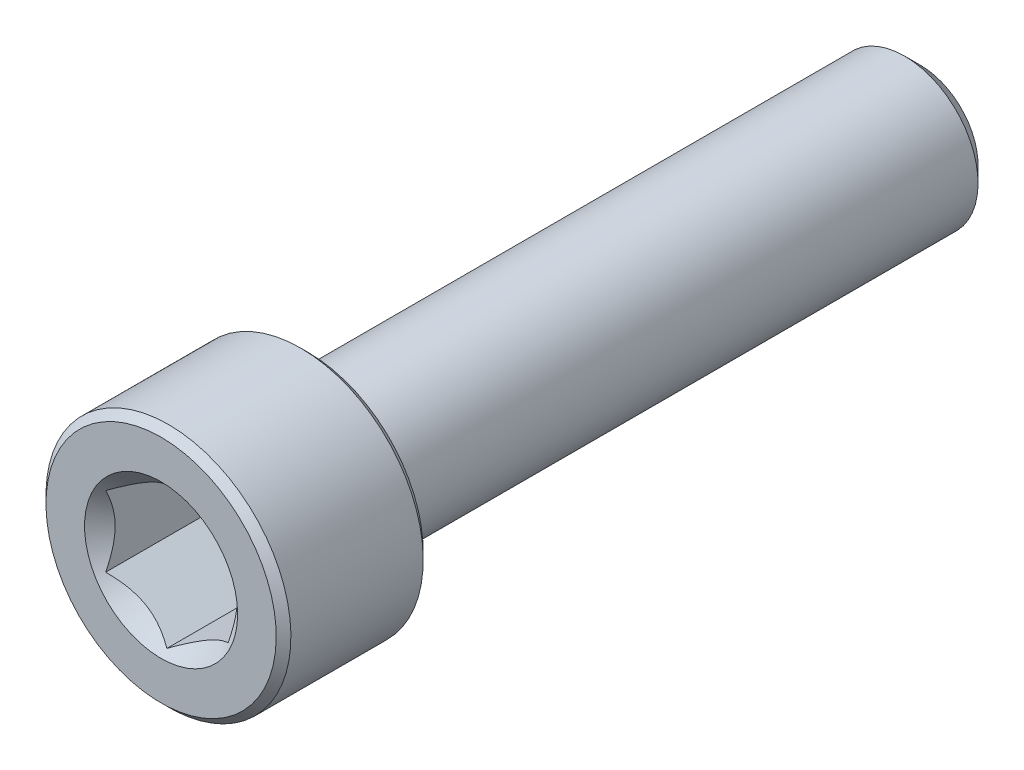
ISO-10303-21;
HEADER;
FILE_DESCRIPTION(('STEP AP214'),'2;1');
FILE_NAME('part.step','',(''),(''),'','','');
FILE_SCHEMA(('AUTOMOTIVE_DESIGN { 1 0 10303 214 1 1 1 1 }'));
ENDSEC;
DATA;
#1=APPLICATION_CONTEXT('core data for automotive mechanical design processes');
#2=APPLICATION_PROTOCOL_DEFINITION('international standard','automotive_design',2000,#1);
#3=PRODUCT_CONTEXT('',#1,'mechanical');
#4=PRODUCT('Part','Part','',(#3));
#5=PRODUCT_RELATED_PRODUCT_CATEGORY('part','',(#4));
#6=PRODUCT_DEFINITION_FORMATION('','',#4);
#7=PRODUCT_DEFINITION_CONTEXT('part definition',#1,'design');
#8=PRODUCT_DEFINITION('design','',#6,#7);
#9=PRODUCT_DEFINITION_SHAPE('','',#8);
#10=(LENGTH_UNIT() NAMED_UNIT(*) SI_UNIT(.MILLI.,.METRE.));
#11=(NAMED_UNIT(*) PLANE_ANGLE_UNIT() SI_UNIT($,.RADIAN.));
#12=(NAMED_UNIT(*) SI_UNIT($,.STERADIAN.) SOLID_ANGLE_UNIT());
#13=UNCERTAINTY_MEASURE_WITH_UNIT(LENGTH_MEASURE(1.E-05),#10,'distance_accuracy_value','');
#14=(GEOMETRIC_REPRESENTATION_CONTEXT(3) GLOBAL_UNCERTAINTY_ASSIGNED_CONTEXT((#13)) GLOBAL_UNIT_ASSIGNED_CONTEXT((#10,
#11,#12)) REPRESENTATION_CONTEXT('',''));
#15=CARTESIAN_POINT('',(0.,0.,0.));
#16=DIRECTION('',(0.,0.,1.));
#17=DIRECTION('',(1.,0.,0.));
#18=AXIS2_PLACEMENT_3D('',#15,#16,#17);
#19=CARTESIAN_POINT('',(0.,2.35048094716167,-15.5));
#20=DIRECTION('',(0.,0.,-1.));
#21=DIRECTION('',(0.,1.,0.));
#22=AXIS2_PLACEMENT_3D('',#19,#20,#21);
#23=PLANE('',#22);
#24=CARTESIAN_POINT('',(0.,0.,-15.5));
#25=DIRECTION('',(0.,0.,-1.));
#26=DIRECTION('',(0.,1.,0.));
#27=AXIS2_PLACEMENT_3D('',#24,#25,#26);
#28=CIRCLE('',#27,2.35048094716167);
#29=CARTESIAN_POINT('',(0.,2.35048094716167,-15.5));
#30=VERTEX_POINT('',#29);
#31=EDGE_CURVE('E52',#30,#30,#28,.T.);
#32=ORIENTED_EDGE('',*,*,#31,.T.);
#33=EDGE_LOOP('',(#32));
#34=FACE_BOUND('',#33,.T.);
#35=ADVANCED_FACE('F39',(#34),#23,.T.);
#36=CARTESIAN_POINT('',(0.,0.,-15.5));
#37=DIRECTION('',(0.,0.,1.));
#38=DIRECTION('',(0.,-1.,0.));
#39=AXIS2_PLACEMENT_3D('',#36,#37,#38);
#40=CONICAL_SURFACE('',#39,2.35048094716167,0.785398163397448);
#41=CARTESIAN_POINT('',(0.,0.,-14.8504809471617));
#42=DIRECTION('',(0.,0.,-1.));
#43=DIRECTION('',(0.,1.,0.));
#44=AXIS2_PLACEMENT_3D('',#41,#42,#43);
#45=CIRCLE('',#44,3.);
#46=CARTESIAN_POINT('',(0.,3.,-14.8504809471617));
#47=VERTEX_POINT('',#46);
#48=EDGE_CURVE('E155',#47,#47,#45,.T.);
#49=ORIENTED_EDGE('',*,*,#48,.T.);
#50=EDGE_LOOP('',(#49));
#51=FACE_BOUND('',#50,.T.);
#52=ORIENTED_EDGE('',*,*,#31,.F.);
#53=EDGE_LOOP('',(#52));
#54=FACE_BOUND('',#53,.T.);
#55=ADVANCED_FACE('F161',(#51,#54),#40,.T.);
#56=CARTESIAN_POINT('',(0.,0.,-15.5));
#57=DIRECTION('',(0.,0.,-1.));
#58=DIRECTION('',(0.,1.,0.));
#59=AXIS2_PLACEMENT_3D('',#56,#57,#58);
#60=CYLINDRICAL_SURFACE('',#59,3.);
#61=CARTESIAN_POINT('',(0.,0.,9.2));
#62=DIRECTION('',(0.,0.,-1.));
#63=DIRECTION('',(0.,1.,0.));
#64=AXIS2_PLACEMENT_3D('',#61,#62,#63);
#65=CIRCLE('',#64,3.);
#66=CARTESIAN_POINT('',(0.,3.,9.2));
#67=VERTEX_POINT('',#66);
#68=EDGE_CURVE('E152',#67,#67,#65,.T.);
#69=ORIENTED_EDGE('',*,*,#68,.T.);
#70=EDGE_LOOP('',(#69));
#71=FACE_BOUND('',#70,.T.);
#72=ORIENTED_EDGE('',*,*,#48,.F.);
#73=EDGE_LOOP('',(#72));
#74=FACE_BOUND('',#73,.T.);
#75=ADVANCED_FACE('F163',(#71,#74),#60,.T.);
#76=CARTESIAN_POINT('',(0.,0.,9.2));
#77=DIRECTION('',(0.,0.,-1.));
#78=DIRECTION('',(0.,1.,0.));
#79=AXIS2_PLACEMENT_3D('',#76,#77,#78);
#80=TOROIDAL_SURFACE('',#79,3.3,0.299999999999999);
#81=CARTESIAN_POINT('',(0.,0.,9.5));
#82=DIRECTION('',(0.,0.,-1.));
#83=DIRECTION('',(0.,1.,0.));
#84=AXIS2_PLACEMENT_3D('',#81,#82,#83);
#85=CIRCLE('',#84,3.3);
#86=CARTESIAN_POINT('',(0.,3.3,9.5));
#87=VERTEX_POINT('',#86);
#88=EDGE_CURVE('E149',#87,#87,#85,.T.);
#89=ORIENTED_EDGE('',*,*,#88,.T.);
#90=EDGE_LOOP('',(#89));
#91=FACE_BOUND('',#90,.T.);
#92=ORIENTED_EDGE('',*,*,#68,.F.);
#93=EDGE_LOOP('',(#92));
#94=FACE_BOUND('',#93,.T.);
#95=ADVANCED_FACE('F169',(#91,#94),#80,.F.);
#96=CARTESIAN_POINT('',(0.,4.7,9.5));
#97=DIRECTION('',(0.,0.,-1.));
#98=DIRECTION('',(0.,1.,0.));
#99=AXIS2_PLACEMENT_3D('',#96,#97,#98);
#100=PLANE('',#99);
#101=CARTESIAN_POINT('',(0.,0.,9.5));
#102=DIRECTION('',(0.,0.,-1.));
#103=DIRECTION('',(0.,1.,0.));
#104=AXIS2_PLACEMENT_3D('',#101,#102,#103);
#105=CIRCLE('',#104,4.7);
#106=CARTESIAN_POINT('',(0.,4.7,9.5));
#107=VERTEX_POINT('',#106);
#108=EDGE_CURVE('E146',#107,#107,#105,.T.);
#109=ORIENTED_EDGE('',*,*,#108,.T.);
#110=EDGE_LOOP('',(#109));
#111=FACE_BOUND('',#110,.T.);
#112=ORIENTED_EDGE('',*,*,#88,.F.);
#113=EDGE_LOOP('',(#112));
#114=FACE_BOUND('',#113,.T.);
#115=ADVANCED_FACE('F175',(#111,#114),#100,.T.);
#116=CARTESIAN_POINT('',(0.,0.,9.5));
#117=DIRECTION('',(0.,0.,1.));
#118=DIRECTION('',(0.,-1.,0.));
#119=AXIS2_PLACEMENT_3D('',#116,#117,#118);
#120=CONICAL_SURFACE('',#119,4.7,0.785398163397445);
#121=CARTESIAN_POINT('',(0.,0.,9.8));
#122=DIRECTION('',(0.,0.,-1.));
#123=DIRECTION('',(0.,1.,0.));
#124=AXIS2_PLACEMENT_3D('',#121,#122,#123);
#125=CIRCLE('',#124,5.);
#126=CARTESIAN_POINT('',(0.,5.,9.8));
#127=VERTEX_POINT('',#126);
#128=EDGE_CURVE('E143',#127,#127,#125,.T.);
#129=ORIENTED_EDGE('',*,*,#128,.T.);
#130=EDGE_LOOP('',(#129));
#131=FACE_BOUND('',#130,.T.);
#132=ORIENTED_EDGE('',*,*,#108,.F.);
#133=EDGE_LOOP('',(#132));
#134=FACE_BOUND('',#133,.T.);
#135=ADVANCED_FACE('F179',(#131,#134),#120,.T.);
#136=CARTESIAN_POINT('',(0.,0.,-15.5));
#137=DIRECTION('',(0.,0.,-1.));
#138=DIRECTION('',(0.,1.,0.));
#139=AXIS2_PLACEMENT_3D('',#136,#137,#138);
#140=CYLINDRICAL_SURFACE('',#139,5.);
#141=CARTESIAN_POINT('',(0.,0.,15.2));
#142=DIRECTION('',(0.,0.,-1.));
#143=DIRECTION('',(0.,1.,0.));
#144=AXIS2_PLACEMENT_3D('',#141,#142,#143);
#145=CIRCLE('',#144,5.);
#146=CARTESIAN_POINT('',(0.,5.,15.2));
#147=VERTEX_POINT('',#146);
#148=EDGE_CURVE('E140',#147,#147,#145,.T.);
#149=ORIENTED_EDGE('',*,*,#148,.T.);
#150=EDGE_LOOP('',(#149));
#151=FACE_BOUND('',#150,.T.);
#152=ORIENTED_EDGE('',*,*,#128,.F.);
#153=EDGE_LOOP('',(#152));
#154=FACE_BOUND('',#153,.T.);
#155=ADVANCED_FACE('F183',(#151,#154),#140,.T.);
#156=CARTESIAN_POINT('',(0.,0.,15.2));
#157=DIRECTION('',(0.,0.,-1.));
#158=DIRECTION('',(0.,1.,0.));
#159=AXIS2_PLACEMENT_3D('',#156,#157,#158);
#160=CONICAL_SURFACE('',#159,5.,0.785398163397445);
#161=CARTESIAN_POINT('',(0.,0.,15.5));
#162=DIRECTION('',(0.,0.,-1.));
#163=DIRECTION('',(0.,1.,0.));
#164=AXIS2_PLACEMENT_3D('',#161,#162,#163);
#165=CIRCLE('',#164,4.7);
#166=CARTESIAN_POINT('',(0.,4.7,15.5));
#167=VERTEX_POINT('',#166);
#168=EDGE_CURVE('E137',#167,#167,#165,.T.);
#169=ORIENTED_EDGE('',*,*,#168,.T.);
#170=EDGE_LOOP('',(#169));
#171=FACE_BOUND('',#170,.T.);
#172=ORIENTED_EDGE('',*,*,#148,.F.);
#173=EDGE_LOOP('',(#172));
#174=FACE_BOUND('',#173,.T.);
#175=ADVANCED_FACE('F187',(#171,#174),#160,.T.);
#176=CARTESIAN_POINT('',(0.,0.,15.5));
#177=DIRECTION('',(0.,0.,1.));
#178=DIRECTION('',(0.,-1.,0.));
#179=AXIS2_PLACEMENT_3D('',#176,#177,#178);
#180=PLANE('',#179);
#181=CARTESIAN_POINT('',(0.,0.,15.5));
#182=DIRECTION('',(0.,0.,1.));
#183=DIRECTION('',(1.,0.,0.));
#184=AXIS2_PLACEMENT_3D('',#181,#182,#183);
#185=CIRCLE('',#184,3.125);
#186=CARTESIAN_POINT('',(3.125,0.,15.5));
#187=VERTEX_POINT('',#186);
#188=EDGE_CURVE('E111',#187,#187,#185,.T.);
#189=ORIENTED_EDGE('',*,*,#188,.F.);
#190=EDGE_LOOP('',(#189));
#191=FACE_BOUND('',#190,.T.);
#192=ORIENTED_EDGE('',*,*,#168,.F.);
#193=EDGE_LOOP('',(#192));
#194=FACE_BOUND('',#193,.T.);
#195=ADVANCED_FACE('F191',(#191,#194),#180,.T.);
#196=CARTESIAN_POINT('',(0.,0.,15.5));
#197=DIRECTION('',(0.,0.,1.));
#198=DIRECTION('',(1.,0.,0.));
#199=AXIS2_PLACEMENT_3D('',#196,#197,#198);
#200=CONICAL_SURFACE('',#199,3.125,0.78539816339745);
#201=ORIENTED_EDGE('',*,*,#188,.T.);
#202=EDGE_LOOP('',(#201));
#203=FACE_BOUND('',#202,.T.);
#204=CARTESIAN_POINT('',(-0.000200000000000056,-2.88686681600197,15.2618668229299));
#205=CARTESIAN_POINT('',(0.0857382777877649,-2.83725032818751,15.2122920513029));
#206=CARTESIAN_POINT('',(0.173113567275753,-2.7868041812811,15.1656288273106));
#207=CARTESIAN_POINT('',(0.351281456165589,-2.6839389026696,15.0801894859864));
#208=CARTESIAN_POINT('',(0.442091000681075,-2.6315099876986,15.0414609083541));
#209=CARTESIAN_POINT('',(0.625204123126921,-2.52578957716234,14.9751180498459));
#210=CARTESIAN_POINT('',(0.71746106452934,-2.47252500720904,14.947337014479));
#211=CARTESIAN_POINT('',(0.904006008776285,-2.3648232334321,14.9045345218588));
#212=CARTESIAN_POINT('',(0.998288312566282,-2.31038931995913,14.8894811126195));
#213=CARTESIAN_POINT('',(1.16077825829184,-2.21657570605387,14.8758990681576));
#214=CARTESIAN_POINT('',(1.22877596788015,-2.17731721011878,14.8738884451889));
#215=CARTESIAN_POINT('',(1.36466024116922,-2.0988643883567,14.8772754631356));
#216=CARTESIAN_POINT('',(1.43254675755224,-2.05967008984862,14.882675701248));
#217=CARTESIAN_POINT('',(1.56767878823611,-1.98165157555715,14.9005771343506));
#218=CARTESIAN_POINT('',(1.63492349975356,-1.94282782326097,14.9130862729946));
#219=CARTESIAN_POINT('',(1.7682501008182,-1.86585167424616,14.9445188479038));
#220=CARTESIAN_POINT('',(1.83433207909966,-1.82769922629678,14.9634417924449));
#221=CARTESIAN_POINT('',(2.00359634669126,-1.72997445583858,15.0196187073564));
#222=CARTESIAN_POINT('',(2.10572912222289,-1.67100807039231,15.0611071775443));
#223=CARTESIAN_POINT('',(2.25590641494051,-1.58430317001562,15.1311453926712));
#224=CARTESIAN_POINT('',(2.30539653988261,-1.55573003305807,15.1557535980642));
#225=CARTESIAN_POINT('',(2.40346006383885,-1.49911303110426,15.2072132326634));
#226=CARTESIAN_POINT('',(2.45203400349693,-1.47106885396706,15.2340632847275));
#227=CARTESIAN_POINT('',(2.5002,-1.44326020292023,15.2618668229299));
#228=B_SPLINE_CURVE_WITH_KNOTS('',3,(#204,#205,#206,#207,#208,#209,#210,#211,#212,#213,#214,
#215,#216,#217,#218,#219,#220,#221,#222,#223,#224,#225,#226,#227),.UNSPECIFIED.,.F.,.F.,(4,2,2,
2,2,2,2,2,2,2,2,4),(0.,0.333012085133924,0.667964518301398,0.997597032043298,1.32639954393844,
1.56169424147169,1.79707142102083,2.03271213522171,2.2683347877565,2.64260240809533,
2.82922877818864,3.01574133749025),.UNSPECIFIED.);
#229=CARTESIAN_POINT('',(0.,-2.88675134594813,15.2617513459481));
#230=VERTEX_POINT('',#229);
#231=CARTESIAN_POINT('',(2.5,-1.44337567297406,15.2617513459481));
#232=VERTEX_POINT('',#231);
#233=EDGE_CURVE('E12',#230,#232,#228,.T.);
#234=ORIENTED_EDGE('',*,*,#233,.F.);
#235=CARTESIAN_POINT('',(-2.5002,-1.44326020292023,15.2618668229299));
#236=CARTESIAN_POINT('',(-2.41426172221224,-1.49287669073469,15.2122920513029));
#237=CARTESIAN_POINT('',(-2.32688643272425,-1.5433228376411,15.1656288273106));
#238=CARTESIAN_POINT('',(-2.14871854383441,-1.64618811625259,15.0801894859864));
#239=CARTESIAN_POINT('',(-2.05790899931892,-1.69861703122359,15.0414609083541));
#240=CARTESIAN_POINT('',(-1.87479587687308,-1.80433744175986,14.9751180498459));
#241=CARTESIAN_POINT('',(-1.78253893547066,-1.85760201171315,14.947337014479));
#242=CARTESIAN_POINT('',(-1.59599399122371,-1.96530378549009,14.9045345218588));
#243=CARTESIAN_POINT('',(-1.50171168743372,-2.01973769896307,14.8894811126195));
#244=CARTESIAN_POINT('',(-1.33922174170816,-2.11355131286833,14.8758990681576));
#245=CARTESIAN_POINT('',(-1.27122403211985,-2.15280980880341,14.8738884451889));
#246=CARTESIAN_POINT('',(-1.13533975883078,-2.23126263056549,14.8772754631356));
#247=CARTESIAN_POINT('',(-1.06745324244776,-2.27045692907357,14.882675701248));
#248=CARTESIAN_POINT('',(-0.932321211763895,-2.34847544336505,14.9005771343506));
#249=CARTESIAN_POINT('',(-0.86507650024644,-2.38729919566123,14.9130862729946));
#250=CARTESIAN_POINT('',(-0.731749899181802,-2.46427534467603,14.9445188479038));
#251=CARTESIAN_POINT('',(-0.665667920900344,-2.50242779262542,14.9634417924449));
#252=CARTESIAN_POINT('',(-0.496403653308736,-2.60015256308362,15.0196187073564));
#253=CARTESIAN_POINT('',(-0.394270877777108,-2.65911894852989,15.0611071775443));
#254=CARTESIAN_POINT('',(-0.244093585059491,-2.74582384890657,15.1311453926712));
#255=CARTESIAN_POINT('',(-0.194603460117391,-2.77439698586412,15.1557535980642));
#256=CARTESIAN_POINT('',(-0.0965399361611529,-2.83101398781794,15.2072132326634));
#257=CARTESIAN_POINT('',(-0.0479659965030717,-2.85905816495513,15.2340632847275));
#258=CARTESIAN_POINT('',(0.000200000000000305,-2.88686681600197,15.2618668229299));
#259=B_SPLINE_CURVE_WITH_KNOTS('',3,(#235,#236,#237,#238,#239,#240,#241,#242,#243,#244,#245,
#246,#247,#248,#249,#250,#251,#252,#253,#254,#255,#256,#257,#258),.UNSPECIFIED.,.F.,.F.,(4,2,2,
2,2,2,2,2,2,2,2,4),(0.,0.333012085133924,0.667964518301397,0.997597032043299,1.32639954393844,
1.56169424147168,1.79707142102083,2.03271213522171,2.2683347877565,2.64260240809533,
2.82922877818864,3.01574133749025),.UNSPECIFIED.);
#260=CARTESIAN_POINT('',(-2.5,-1.44337567297406,15.2617513459481));
#261=VERTEX_POINT('',#260);
#262=EDGE_CURVE('E97',#261,#230,#259,.T.);
#263=ORIENTED_EDGE('',*,*,#262,.F.);
#264=CARTESIAN_POINT('',(-2.5,-3.05811902614614,16.3249483513176));
#265=CARTESIAN_POINT('',(-2.5,-2.98440983945656,16.2678941624606));
#266=CARTESIAN_POINT('',(-2.5,-2.91030875691711,16.211338408655));
#267=CARTESIAN_POINT('',(-2.5,-2.76116077091499,16.0994529908989));
#268=CARTESIAN_POINT('',(-2.5,-2.68611365209695,16.0441236143263));
#269=CARTESIAN_POINT('',(-2.5,-2.53436379087041,15.9345266506783));
#270=CARTESIAN_POINT('',(-2.5,-2.45765275083383,15.8802705155369));
#271=CARTESIAN_POINT('',(-2.5,-2.30296317551963,15.7736026001631));
#272=CARTESIAN_POINT('',(-2.5,-2.22498472739569,15.7211906938896));
#273=CARTESIAN_POINT('',(-2.5,-2.06236769759978,15.615263211588));
#274=CARTESIAN_POINT('',(-2.5,-1.97762830350827,15.5619016261172));
#275=CARTESIAN_POINT('',(-2.5,-1.80618229870077,15.4584430751365));
#276=CARTESIAN_POINT('',(-2.5,-1.71947594494662,15.4083456864684));
#277=CARTESIAN_POINT('',(-2.5,-1.54402392194024,15.3124525300635));
#278=CARTESIAN_POINT('',(-2.5,-1.45528486870173,15.2666447518847));
#279=CARTESIAN_POINT('',(-2.5,-1.27526975606122,15.1803657409276));
#280=CARTESIAN_POINT('',(-2.5,-1.18399493457035,15.1398919577617));
#281=CARTESIAN_POINT('',(-2.5,-1.00836471270812,15.0696282555703));
#282=CARTESIAN_POINT('',(-2.5,-0.924281821785677,15.0391640684491));
#283=CARTESIAN_POINT('',(-2.5,-0.753934603970129,14.9849624341985));
#284=CARTESIAN_POINT('',(-2.5,-0.667670141814684,14.9612254052873));
#285=CARTESIAN_POINT('',(-2.5,-0.495001348242841,14.9221752112613));
#286=CARTESIAN_POINT('',(-2.5,-0.408632911050733,14.906706028656));
#287=CARTESIAN_POINT('',(-2.5,-0.234772754668958,14.8845210883891));
#288=CARTESIAN_POINT('',(-2.5,-0.147281287804294,14.8778033980202));
#289=CARTESIAN_POINT('',(-2.5,0.0238518936773456,14.8737182218653));
#290=CARTESIAN_POINT('',(-2.5,0.107483635135722,14.8759308676149));
#291=CARTESIAN_POINT('',(-2.5,0.274114195685814,14.8886096800111));
#292=CARTESIAN_POINT('',(-2.5,0.35711295814558,14.8990765766091));
#293=CARTESIAN_POINT('',(-2.5,0.523288144897417,14.9278421327409));
#294=CARTESIAN_POINT('',(-2.5,0.606439950061686,14.9462808031454));
#295=CARTESIAN_POINT('',(-2.5,0.770896010035104,14.989956208676));
#296=CARTESIAN_POINT('',(-2.5,0.852200351882828,15.0151926228204));
#297=CARTESIAN_POINT('',(-2.5,1.10064624940811,15.1020006776711));
#298=CARTESIAN_POINT('',(-2.5,1.26445670942465,15.1731337561378));
#299=CARTESIAN_POINT('',(-2.5,1.50421272270141,15.2918201200772));
#300=CARTESIAN_POINT('',(-2.5,1.58328419057904,15.333471615305));
#301=CARTESIAN_POINT('',(-2.5,1.73963927584191,15.4200124035774));
#302=CARTESIAN_POINT('',(-2.5,1.81692320237102,15.4649011311494));
#303=CARTESIAN_POINT('',(-2.5,1.96613896389381,15.5549912173065));
#304=CARTESIAN_POINT('',(-2.5,2.03814682362153,15.6000680708391));
#305=CARTESIAN_POINT('',(-2.5,2.18092679643222,15.6921473192976));
#306=CARTESIAN_POINT('',(-2.5,2.25169881661102,15.7391498581055));
#307=CARTESIAN_POINT('',(-2.5,2.39159945333183,15.8343550134732));
#308=CARTESIAN_POINT('',(-2.5,2.46073668867174,15.8825450175112));
#309=CARTESIAN_POINT('',(-2.5,2.59806183277128,15.9802211436377));
#310=CARTESIAN_POINT('',(-2.5,2.66624999804919,16.0297069046595));
#311=CARTESIAN_POINT('',(-2.5,2.73404006469875,16.0797233466722));
#312=B_SPLINE_CURVE_WITH_KNOTS('',3,(#264,#265,#266,#267,#268,#269,#270,#271,#272,#273,#274,
#275,#276,#277,#278,#279,#280,#281,#282,#283,#284,#285,#286,#287,#288,#289,#290,#291,#292,#293,
#294,#295,#296,#297,#298,#299,#300,#301,#302,#303,#304,#305,#306,#307,#308,#309,#310,#311),
.UNSPECIFIED.,.F.,.F.,(4,2,2,2,2,2,2,2,2,2,2,2,2,2,2,2,2,2,2,2,2,2,2,4),(0.,0.279636937737095,
0.559338724655691,0.841193583356592,1.1230291415439,1.42339426279004,1.72372036804098,
2.02317874224782,2.32249341038693,2.59055815083283,2.85863955284488,3.12146553699264,
3.38423346797086,3.63479445639969,3.88537760527732,4.14055298164195,4.39571631103123,
4.92983151325628,5.19792074748275,5.46596326536873,5.72079181091925,5.9756394314289,
6.22844778309936,6.48118642327295),.UNSPECIFIED.);
#313=CARTESIAN_POINT('',(-2.5,1.44337567297406,15.2617513459481));
#314=VERTEX_POINT('',#313);
#315=EDGE_CURVE('E110',#314,#261,#312,.F.);
#316=ORIENTED_EDGE('',*,*,#315,.F.);
#317=CARTESIAN_POINT('',(0.000199999999999188,2.88686681600197,15.2618668229299));
#318=CARTESIAN_POINT('',(-0.0857382777877659,2.83725032818751,15.2122920513029));
#319=CARTESIAN_POINT('',(-0.173113567275754,2.7868041812811,15.1656288273106));
#320=CARTESIAN_POINT('',(-0.351281456165589,2.6839389026696,15.0801894859864));
#321=CARTESIAN_POINT('',(-0.442091000681075,2.6315099876986,15.0414609083541));
#322=CARTESIAN_POINT('',(-0.625204123126921,2.52578957716234,14.9751180498459));
#323=CARTESIAN_POINT('',(-0.71746106452934,2.47252500720904,14.947337014479));
#324=CARTESIAN_POINT('',(-0.904006008776285,2.3648232334321,14.9045345218588));
#325=CARTESIAN_POINT('',(-0.998288312566282,2.31038931995913,14.8894811126195));
#326=CARTESIAN_POINT('',(-1.16077825829184,2.21657570605387,14.8758990681576));
#327=CARTESIAN_POINT('',(-1.22877596788015,2.17731721011878,14.8738884451889));
#328=CARTESIAN_POINT('',(-1.36466024116922,2.0988643883567,14.8772754631356));
#329=CARTESIAN_POINT('',(-1.43254675755224,2.05967008984862,14.8826757012479));
#330=CARTESIAN_POINT('',(-1.5676787882361,1.98165157555715,14.9005771343506));
#331=CARTESIAN_POINT('',(-1.63492349975356,1.94282782326097,14.9130862729946));
#332=CARTESIAN_POINT('',(-1.7682501008182,1.86585167424616,14.9445188479038));
#333=CARTESIAN_POINT('',(-1.83433207909966,1.82769922629678,14.9634417924449));
#334=CARTESIAN_POINT('',(-2.00359634669126,1.72997445583858,15.0196187073564));
#335=CARTESIAN_POINT('',(-2.10572912222289,1.67100807039231,15.0611071775443));
#336=CARTESIAN_POINT('',(-2.25590641494051,1.58430317001562,15.1311453926712));
#337=CARTESIAN_POINT('',(-2.30539653988261,1.55573003305807,15.1557535980642));
#338=CARTESIAN_POINT('',(-2.40346006383885,1.49911303110425,15.2072132326634));
#339=CARTESIAN_POINT('',(-2.45203400349693,1.47106885396706,15.2340632847275));
#340=CARTESIAN_POINT('',(-2.5002,1.44326020292023,15.2618668229299));
#341=B_SPLINE_CURVE_WITH_KNOTS('',3,(#317,#318,#319,#320,#321,#322,#323,#324,#325,#326,#327,
#328,#329,#330,#331,#332,#333,#334,#335,#336,#337,#338,#339,#340),.UNSPECIFIED.,.F.,.F.,(4,2,2,
2,2,2,2,2,2,2,2,4),(0.,0.333012085133923,0.667964518301396,0.997597032043297,1.32639954393844,
1.56169424147168,1.79707142102082,2.0327121352217,2.2683347877565,2.64260240809533,
2.82922877818864,3.01574133749025),.UNSPECIFIED.);
#342=CARTESIAN_POINT('',(0.,2.88675134594813,15.2617513459481));
#343=VERTEX_POINT('',#342);
#344=EDGE_CURVE('E241',#343,#314,#341,.T.);
#345=ORIENTED_EDGE('',*,*,#344,.F.);
#346=CARTESIAN_POINT('',(2.5002,1.44326020292023,15.2618668229299));
#347=CARTESIAN_POINT('',(2.41426172221224,1.49287669073468,15.2122920513029));
#348=CARTESIAN_POINT('',(2.32688643272425,1.5433228376411,15.1656288273106));
#349=CARTESIAN_POINT('',(2.14871854383441,1.64618811625259,15.0801894859864));
#350=CARTESIAN_POINT('',(2.05790899931892,1.69861703122359,15.0414609083541));
#351=CARTESIAN_POINT('',(1.87479587687308,1.80433744175986,14.9751180498459));
#352=CARTESIAN_POINT('',(1.78253893547066,1.85760201171315,14.947337014479));
#353=CARTESIAN_POINT('',(1.59599399122371,1.96530378549009,14.9045345218588));
#354=CARTESIAN_POINT('',(1.50171168743372,2.01973769896307,14.8894811126195));
#355=CARTESIAN_POINT('',(1.33922174170815,2.11355131286833,14.8758990681576));
#356=CARTESIAN_POINT('',(1.27122403211985,2.15280980880341,14.8738884451889));
#357=CARTESIAN_POINT('',(1.13533975883078,2.23126263056549,14.8772754631356));
#358=CARTESIAN_POINT('',(1.06745324244776,2.27045692907357,14.8826757012479));
#359=CARTESIAN_POINT('',(0.932321211763893,2.34847544336505,14.9005771343506));
#360=CARTESIAN_POINT('',(0.865076500246439,2.38729919566123,14.9130862729946));
#361=CARTESIAN_POINT('',(0.7317498991818,2.46427534467603,14.9445188479038));
#362=CARTESIAN_POINT('',(0.665667920900342,2.50242779262542,14.9634417924449));
#363=CARTESIAN_POINT('',(0.496403653308734,2.60015256308362,15.0196187073564));
#364=CARTESIAN_POINT('',(0.394270877777107,2.65911894852989,15.0611071775443));
#365=CARTESIAN_POINT('',(0.244093585059491,2.74582384890657,15.1311453926712));
#366=CARTESIAN_POINT('',(0.19460346011739,2.77439698586412,15.1557535980642));
#367=CARTESIAN_POINT('',(0.0965399361611528,2.83101398781794,15.2072132326634));
#368=CARTESIAN_POINT('',(0.0479659965030716,2.85905816495513,15.2340632847275));
#369=CARTESIAN_POINT('',(-0.000200000000000713,2.88686681600197,15.2618668229299));
#370=B_SPLINE_CURVE_WITH_KNOTS('',3,(#346,#347,#348,#349,#350,#351,#352,#353,#354,#355,#356,
#357,#358,#359,#360,#361,#362,#363,#364,#365,#366,#367,#368,#369),.UNSPECIFIED.,.F.,.F.,(4,2,2,
2,2,2,2,2,2,2,2,4),(0.,0.333012085133925,0.667964518301398,0.997597032043301,1.32639954393844,
1.56169424147169,1.79707142102083,2.03271213522171,2.26833478775651,2.64260240809533,
2.82922877818864,3.01574133749025),.UNSPECIFIED.);
#371=CARTESIAN_POINT('',(2.5,1.44337567297406,15.2617513459481));
#372=VERTEX_POINT('',#371);
#373=EDGE_CURVE('E214',#372,#343,#370,.T.);
#374=ORIENTED_EDGE('',*,*,#373,.F.);
#375=CARTESIAN_POINT('',(2.5,-3.05811902614615,16.3249483513177));
#376=CARTESIAN_POINT('',(2.5,-2.98440983945656,16.2678941624606));
#377=CARTESIAN_POINT('',(2.5,-2.91030875691711,16.211338408655));
#378=CARTESIAN_POINT('',(2.5,-2.76116077091499,16.0994529908989));
#379=CARTESIAN_POINT('',(2.5,-2.68611365209695,16.0441236143263));
#380=CARTESIAN_POINT('',(2.5,-2.53436379087042,15.9345266506783));
#381=CARTESIAN_POINT('',(2.5,-2.45765275083384,15.8802705155369));
#382=CARTESIAN_POINT('',(2.5,-2.30296317551963,15.7736026001631));
#383=CARTESIAN_POINT('',(2.5,-2.2249847273957,15.7211906938896));
#384=CARTESIAN_POINT('',(2.5,-2.06236769759979,15.615263211588));
#385=CARTESIAN_POINT('',(2.5,-1.97762830350827,15.5619016261172));
#386=CARTESIAN_POINT('',(2.5,-1.80618229870077,15.4584430751365));
#387=CARTESIAN_POINT('',(2.5,-1.71947594494662,15.4083456864684));
#388=CARTESIAN_POINT('',(2.5,-1.54402392194024,15.3124525300635));
#389=CARTESIAN_POINT('',(2.5,-1.45528486870173,15.2666447518847));
#390=CARTESIAN_POINT('',(2.5,-1.27526975606122,15.1803657409276));
#391=CARTESIAN_POINT('',(2.5,-1.18399493457035,15.1398919577617));
#392=CARTESIAN_POINT('',(2.5,-1.00836471270812,15.0696282555703));
#393=CARTESIAN_POINT('',(2.5,-0.924281821785679,15.0391640684491));
#394=CARTESIAN_POINT('',(2.5,-0.753934603970131,14.9849624341985));
#395=CARTESIAN_POINT('',(2.5,-0.667670141814685,14.9612254052873));
#396=CARTESIAN_POINT('',(2.5,-0.495001348242842,14.9221752112613));
#397=CARTESIAN_POINT('',(2.5,-0.408632911050733,14.906706028656));
#398=CARTESIAN_POINT('',(2.5,-0.234772754668958,14.8845210883891));
#399=CARTESIAN_POINT('',(2.5,-0.147281287804293,14.8778033980202));
#400=CARTESIAN_POINT('',(2.5,0.0238518936773465,14.8737182218653));
#401=CARTESIAN_POINT('',(2.5,0.107483635135723,14.8759308676149));
#402=CARTESIAN_POINT('',(2.5,0.274114195685815,14.8886096800111));
#403=CARTESIAN_POINT('',(2.5,0.357112958145581,14.8990765766091));
#404=CARTESIAN_POINT('',(2.5,0.523288144897418,14.9278421327409));
#405=CARTESIAN_POINT('',(2.5,0.606439950061688,14.9462808031454));
#406=CARTESIAN_POINT('',(2.5,0.770896010035105,14.989956208676));
#407=CARTESIAN_POINT('',(2.5,0.85220035188283,15.0151926228204));
#408=CARTESIAN_POINT('',(2.5,1.10064624940811,15.1020006776711));
#409=CARTESIAN_POINT('',(2.5,1.26445670942465,15.1731337561378));
#410=CARTESIAN_POINT('',(2.5,1.50421272270141,15.2918201200772));
#411=CARTESIAN_POINT('',(2.5,1.58328419057904,15.333471615305));
#412=CARTESIAN_POINT('',(2.5,1.73963927584191,15.4200124035774));
#413=CARTESIAN_POINT('',(2.5,1.81692320237102,15.4649011311494));
#414=CARTESIAN_POINT('',(2.5,1.96613896389381,15.5549912173065));
#415=CARTESIAN_POINT('',(2.5,2.03814682362154,15.6000680708391));
#416=CARTESIAN_POINT('',(2.5,2.18092679643222,15.6921473192976));
#417=CARTESIAN_POINT('',(2.5,2.25169881661102,15.7391498581055));
#418=CARTESIAN_POINT('',(2.5,2.39159945333184,15.8343550134732));
#419=CARTESIAN_POINT('',(2.5,2.46073668867174,15.8825450175112));
#420=CARTESIAN_POINT('',(2.5,2.59806183277128,15.9802211436377));
#421=CARTESIAN_POINT('',(2.5,2.6662499980492,16.0297069046595));
#422=CARTESIAN_POINT('',(2.5,2.73404006469875,16.0797233466722));
#423=B_SPLINE_CURVE_WITH_KNOTS('',3,(#375,#376,#377,#378,#379,#380,#381,#382,#383,#384,#385,
#386,#387,#388,#389,#390,#391,#392,#393,#394,#395,#396,#397,#398,#399,#400,#401,#402,#403,#404,
#405,#406,#407,#408,#409,#410,#411,#412,#413,#414,#415,#416,#417,#418,#419,#420,#421,#422),
.UNSPECIFIED.,.F.,.F.,(4,2,2,2,2,2,2,2,2,2,2,2,2,2,2,2,2,2,2,2,2,2,2,4),(0.,0.279636937737097,
0.559338724655692,0.841193583356593,1.1230291415439,1.42339426279004,1.72372036804098,
2.02317874224782,2.32249341038693,2.59055815083283,2.85863955284489,3.12146553699265,
3.38423346797087,3.6347944563997,3.88537760527732,4.14055298164195,4.39571631103124,
4.92983151325628,5.19792074748275,5.46596326536874,5.72079181091925,5.97563943142891,
6.22844778309936,6.48118642327296),.UNSPECIFIED.);
#424=EDGE_CURVE('E59',#232,#372,#423,.T.);
#425=ORIENTED_EDGE('',*,*,#424,.F.);
#426=EDGE_LOOP('',(#234,#263,#316,#345,#374,#425));
#427=FACE_BOUND('',#426,.T.);
#428=ADVANCED_FACE('F96',(#203,#427),#200,.F.);
#429=CARTESIAN_POINT('',(0.,4.7,10.5));
#430=DIRECTION('',(0.,0.,-1.));
#431=DIRECTION('',(0.,1.,0.));
#432=AXIS2_PLACEMENT_3D('',#429,#430,#431);
#433=PLANE('',#432);
#434=DIRECTION('',(0.866025403784439,0.5,0.));
#435=VECTOR('',#434,1.);
#436=CARTESIAN_POINT('',(0.,-2.88675134594813,10.5));
#437=LINE('',#436,#435);
#438=CARTESIAN_POINT('',(0.,-2.88675134594813,10.5));
#439=VERTEX_POINT('',#438);
#440=CARTESIAN_POINT('',(2.5,-1.44337567297406,10.5));
#441=VERTEX_POINT('',#440);
#442=EDGE_CURVE('E114',#439,#441,#437,.T.);
#443=ORIENTED_EDGE('',*,*,#442,.T.);
#444=DIRECTION('',(0.,1.,0.));
#445=VECTOR('',#444,1.);
#446=CARTESIAN_POINT('',(2.5,-1.44337567297406,10.5));
#447=LINE('',#446,#445);
#448=CARTESIAN_POINT('',(2.5,1.44337567297406,10.5));
#449=VERTEX_POINT('',#448);
#450=EDGE_CURVE('E66',#441,#449,#447,.T.);
#451=ORIENTED_EDGE('',*,*,#450,.T.);
#452=DIRECTION('',(-0.866025403784439,0.5,0.));
#453=VECTOR('',#452,1.);
#454=CARTESIAN_POINT('',(2.5,1.44337567297406,10.5));
#455=LINE('',#454,#453);
#456=CARTESIAN_POINT('',(0.,2.88675134594813,10.5));
#457=VERTEX_POINT('',#456);
#458=EDGE_CURVE('E122',#449,#457,#455,.T.);
#459=ORIENTED_EDGE('',*,*,#458,.T.);
#460=DIRECTION('',(-0.866025403784439,-0.5,0.));
#461=VECTOR('',#460,1.);
#462=CARTESIAN_POINT('',(0.,2.88675134594813,10.5));
#463=LINE('',#462,#461);
#464=CARTESIAN_POINT('',(-2.5,1.44337567297406,10.5));
#465=VERTEX_POINT('',#464);
#466=EDGE_CURVE('E129',#457,#465,#463,.T.);
#467=ORIENTED_EDGE('',*,*,#466,.T.);
#468=DIRECTION('',(0.,-1.,0.));
#469=VECTOR('',#468,1.);
#470=CARTESIAN_POINT('',(-2.5,1.44337567297406,10.5));
#471=LINE('',#470,#469);
#472=CARTESIAN_POINT('',(-2.5,-1.44337567297406,10.5));
#473=VERTEX_POINT('',#472);
#474=EDGE_CURVE('E125',#465,#473,#471,.T.);
#475=ORIENTED_EDGE('',*,*,#474,.T.);
#476=DIRECTION('',(0.866025403784439,-0.5,0.));
#477=VECTOR('',#476,1.);
#478=CARTESIAN_POINT('',(-2.5,-1.44337567297406,10.5));
#479=LINE('',#478,#477);
#480=EDGE_CURVE('E115',#473,#439,#479,.T.);
#481=ORIENTED_EDGE('',*,*,#480,.T.);
#482=EDGE_LOOP('',(#443,#451,#459,#467,#475,#481));
#483=FACE_BOUND('',#482,.T.);
#484=ADVANCED_FACE('F196',(#483),#433,.F.);
#485=CARTESIAN_POINT('',(0.,-2.88675134594813,1.86237384174027));
#486=DIRECTION('',(0.5,-0.866025403784439,0.));
#487=DIRECTION('',(0.866025403784439,0.5,0.));
#488=AXIS2_PLACEMENT_3D('',#485,#486,#487);
#489=PLANE('',#488);
#490=DIRECTION('',(0.,0.,1.));
#491=VECTOR('',#490,1.);
#492=CARTESIAN_POINT('',(0.,-2.88675134594813,1.86237384174027));
#493=LINE('',#492,#491);
#494=EDGE_CURVE('E106',#439,#230,#493,.T.);
#495=ORIENTED_EDGE('',*,*,#494,.T.);
#496=ORIENTED_EDGE('',*,*,#233,.T.);
#497=DIRECTION('',(0.,0.,1.));
#498=VECTOR('',#497,1.);
#499=CARTESIAN_POINT('',(2.5,-1.44337567297406,1.86237384174027));
#500=LINE('',#499,#498);
#501=EDGE_CURVE('E117',#441,#232,#500,.T.);
#502=ORIENTED_EDGE('',*,*,#501,.F.);
#503=ORIENTED_EDGE('',*,*,#442,.F.);
#504=EDGE_LOOP('',(#495,#496,#502,#503));
#505=FACE_BOUND('',#504,.T.);
#506=ADVANCED_FACE('F113',(#505),#489,.F.);
#507=CARTESIAN_POINT('',(-2.5,-1.44337567297406,1.86237384174027));
#508=DIRECTION('',(-0.5,-0.866025403784439,0.));
#509=DIRECTION('',(0.866025403784439,-0.5,0.));
#510=AXIS2_PLACEMENT_3D('',#507,#508,#509);
#511=PLANE('',#510);
#512=DIRECTION('',(0.,0.,1.));
#513=VECTOR('',#512,1.);
#514=CARTESIAN_POINT('',(-2.5,-1.44337567297406,1.86237384174027));
#515=LINE('',#514,#513);
#516=EDGE_CURVE('E109',#473,#261,#515,.T.);
#517=ORIENTED_EDGE('',*,*,#516,.T.);
#518=ORIENTED_EDGE('',*,*,#262,.T.);
#519=ORIENTED_EDGE('',*,*,#494,.F.);
#520=ORIENTED_EDGE('',*,*,#480,.F.);
#521=EDGE_LOOP('',(#517,#518,#519,#520));
#522=FACE_BOUND('',#521,.T.);
#523=ADVANCED_FACE('F105',(#522),#511,.F.);
#524=CARTESIAN_POINT('',(-2.5,1.44337567297406,1.86237384174027));
#525=DIRECTION('',(-1.,0.,0.));
#526=DIRECTION('',(0.,0.,1.));
#527=AXIS2_PLACEMENT_3D('',#524,#525,#526);
#528=PLANE('',#527);
#529=DIRECTION('',(0.,0.,1.));
#530=VECTOR('',#529,1.);
#531=CARTESIAN_POINT('',(-2.5,1.44337567297406,1.86237384174027));
#532=LINE('',#531,#530);
#533=EDGE_CURVE('E126',#465,#314,#532,.T.);
#534=ORIENTED_EDGE('',*,*,#533,.T.);
#535=ORIENTED_EDGE('',*,*,#315,.T.);
#536=ORIENTED_EDGE('',*,*,#516,.F.);
#537=ORIENTED_EDGE('',*,*,#474,.F.);
#538=EDGE_LOOP('',(#534,#535,#536,#537));
#539=FACE_BOUND('',#538,.T.);
#540=ADVANCED_FACE('F250',(#539),#528,.F.);
#541=CARTESIAN_POINT('',(0.,2.88675134594813,1.86237384174027));
#542=DIRECTION('',(-0.5,0.866025403784439,0.));
#543=DIRECTION('',(-0.866025403784439,-0.5,0.));
#544=AXIS2_PLACEMENT_3D('',#541,#542,#543);
#545=PLANE('',#544);
#546=DIRECTION('',(0.,0.,1.));
#547=VECTOR('',#546,1.);
#548=CARTESIAN_POINT('',(0.,2.88675134594813,1.86237384174027));
#549=LINE('',#548,#547);
#550=EDGE_CURVE('E130',#457,#343,#549,.T.);
#551=ORIENTED_EDGE('',*,*,#550,.T.);
#552=ORIENTED_EDGE('',*,*,#344,.T.);
#553=ORIENTED_EDGE('',*,*,#533,.F.);
#554=ORIENTED_EDGE('',*,*,#466,.F.);
#555=EDGE_LOOP('',(#551,#552,#553,#554));
#556=FACE_BOUND('',#555,.T.);
#557=ADVANCED_FACE('F247',(#556),#545,.F.);
#558=CARTESIAN_POINT('',(2.5,1.44337567297406,1.86237384174027));
#559=DIRECTION('',(0.5,0.866025403784439,0.));
#560=DIRECTION('',(-0.866025403784439,0.5,0.));
#561=AXIS2_PLACEMENT_3D('',#558,#559,#560);
#562=PLANE('',#561);
#563=DIRECTION('',(0.,0.,1.));
#564=VECTOR('',#563,1.);
#565=CARTESIAN_POINT('',(2.5,1.44337567297406,1.86237384174027));
#566=LINE('',#565,#564);
#567=EDGE_CURVE('E133',#449,#372,#566,.T.);
#568=ORIENTED_EDGE('',*,*,#567,.T.);
#569=ORIENTED_EDGE('',*,*,#373,.T.);
#570=ORIENTED_EDGE('',*,*,#550,.F.);
#571=ORIENTED_EDGE('',*,*,#458,.F.);
#572=EDGE_LOOP('',(#568,#569,#570,#571));
#573=FACE_BOUND('',#572,.T.);
#574=ADVANCED_FACE('F204',(#573),#562,.F.);
#575=CARTESIAN_POINT('',(2.5,-1.44337567297406,1.86237384174027));
#576=DIRECTION('',(1.,0.,0.));
#577=DIRECTION('',(0.,0.,-1.));
#578=AXIS2_PLACEMENT_3D('',#575,#576,#577);
#579=PLANE('',#578);
#580=ORIENTED_EDGE('',*,*,#501,.T.);
#581=ORIENTED_EDGE('',*,*,#424,.T.);
#582=ORIENTED_EDGE('',*,*,#567,.F.);
#583=ORIENTED_EDGE('',*,*,#450,.F.);
#584=EDGE_LOOP('',(#580,#581,#582,#583));
#585=FACE_BOUND('',#584,.T.);
#586=ADVANCED_FACE('F200',(#585),#579,.F.);
#587=CLOSED_SHELL('',(#35,#55,#75,#95,#115,#135,#155,#175,#195,#428,#484,#506,#523,#540,#557,
#574,#586));
#588=MANIFOLD_SOLID_BREP('B2',#587);
#589=ADVANCED_BREP_SHAPE_REPRESENTATION('',(#18,#588),#14);
#590=SHAPE_DEFINITION_REPRESENTATION(#9,#589);
ENDSEC;
END-ISO-10303-21;
